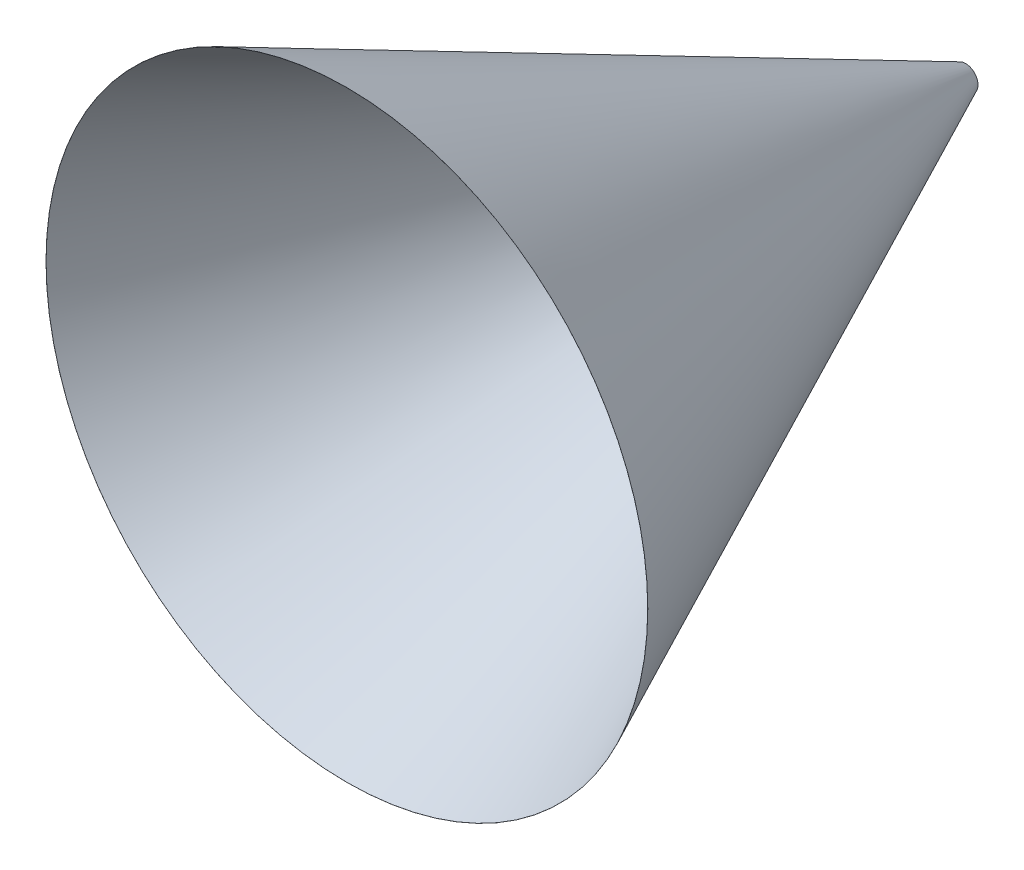
ISO-10303-21;
HEADER;
FILE_DESCRIPTION(('STEP AP214'),'2;1');
FILE_NAME('part.step','',(''),(''),'','','');
FILE_SCHEMA(('AUTOMOTIVE_DESIGN { 1 0 10303 214 1 1 1 1 }'));
ENDSEC;
DATA;
#1=APPLICATION_CONTEXT('core data for automotive mechanical design processes');
#2=APPLICATION_PROTOCOL_DEFINITION('international standard','automotive_design',2000,#1);
#3=PRODUCT_CONTEXT('',#1,'mechanical');
#4=PRODUCT('Part','Part','',(#3));
#5=PRODUCT_RELATED_PRODUCT_CATEGORY('part','',(#4));
#6=PRODUCT_DEFINITION_FORMATION('','',#4);
#7=PRODUCT_DEFINITION_CONTEXT('part definition',#1,'design');
#8=PRODUCT_DEFINITION('design','',#6,#7);
#9=PRODUCT_DEFINITION_SHAPE('','',#8);
#10=(LENGTH_UNIT() NAMED_UNIT(*) SI_UNIT(.MILLI.,.METRE.));
#11=(NAMED_UNIT(*) PLANE_ANGLE_UNIT() SI_UNIT($,.RADIAN.));
#12=(NAMED_UNIT(*) SI_UNIT($,.STERADIAN.) SOLID_ANGLE_UNIT());
#13=UNCERTAINTY_MEASURE_WITH_UNIT(LENGTH_MEASURE(1.E-05),#10,'distance_accuracy_value','');
#14=(GEOMETRIC_REPRESENTATION_CONTEXT(3) GLOBAL_UNCERTAINTY_ASSIGNED_CONTEXT((#13)) GLOBAL_UNIT_ASSIGNED_CONTEXT((#10,
#11,#12)) REPRESENTATION_CONTEXT('',''));
#15=CARTESIAN_POINT('',(0.,0.,0.));
#16=DIRECTION('',(0.,0.,1.));
#17=DIRECTION('',(1.,0.,0.));
#18=AXIS2_PLACEMENT_3D('',#15,#16,#17);
#19=CARTESIAN_POINT('',(0.,0.,0.));
#20=DIRECTION('',(0.,0.,1.));
#21=DIRECTION('',(1.,0.,0.));
#22=AXIS2_PLACEMENT_3D('',#19,#20,#21);
#23=CONICAL_SURFACE('',#22,3.,0.436332312998583);
#24=CARTESIAN_POINT('',(0.,0.,150.));
#25=DIRECTION('',(0.,0.,1.));
#26=DIRECTION('',(1.,0.,0.));
#27=AXIS2_PLACEMENT_3D('',#24,#25,#26);
#28=CIRCLE('',#27,72.9461487232499);
#29=CARTESIAN_POINT('',(72.9461487232499,0.,150.));
#30=VERTEX_POINT('',#29);
#31=EDGE_CURVE('E10',#30,#30,#28,.T.);
#32=CARTESIAN_POINT('',(0.,0.,0.));
#33=DIRECTION('',(0.,0.,1.));
#34=DIRECTION('',(1.,0.,0.));
#35=AXIS2_PLACEMENT_3D('',#32,#33,#34);
#36=CIRCLE('',#35,3.);
#37=CARTESIAN_POINT('',(3.,0.,0.));
#38=VERTEX_POINT('',#37);
#39=EDGE_CURVE('E38',#38,#38,#36,.T.);
#40=CARTESIAN_POINT('',(72.9461487232499,0.,150.));
#41=CARTESIAN_POINT('',(72.2175430073827,0.,148.4375));
#42=CARTESIAN_POINT('',(71.4889372915156,0.,146.875));
#43=CARTESIAN_POINT('',(70.0317258597812,0.,143.75));
#44=CARTESIAN_POINT('',(69.303120143914,0.,142.1875));
#45=CARTESIAN_POINT('',(67.8459087121796,0.,139.0625));
#46=CARTESIAN_POINT('',(67.1173029963124,0.,137.5));
#47=CARTESIAN_POINT('',(65.6600915645781,0.,134.375));
#48=CARTESIAN_POINT('',(64.9314858487109,0.,132.8125));
#49=CARTESIAN_POINT('',(63.4742744169765,0.,129.6875));
#50=CARTESIAN_POINT('',(62.7456687011093,0.,128.125));
#51=CARTESIAN_POINT('',(61.288457269375,0.,125.));
#52=CARTESIAN_POINT('',(60.5598515535078,0.,123.4375));
#53=CARTESIAN_POINT('',(59.1026401217734,0.,120.3125));
#54=CARTESIAN_POINT('',(58.3740344059062,0.,118.75));
#55=CARTESIAN_POINT('',(56.9168229741718,0.,115.625));
#56=CARTESIAN_POINT('',(56.1882172583046,0.,114.0625));
#57=CARTESIAN_POINT('',(54.7310058265703,0.,110.9375));
#58=CARTESIAN_POINT('',(54.0024001107031,0.,109.375));
#59=CARTESIAN_POINT('',(52.5451886789687,0.,106.25));
#60=CARTESIAN_POINT('',(51.8165829631015,0.,104.6875));
#61=CARTESIAN_POINT('',(50.3593715313672,0.,101.5625));
#62=CARTESIAN_POINT('',(49.6307658155,0.,100.));
#63=CARTESIAN_POINT('',(48.1735543837656,0.,96.875));
#64=CARTESIAN_POINT('',(47.4449486678984,0.,95.3125));
#65=CARTESIAN_POINT('',(45.987737236164,0.,92.1875));
#66=CARTESIAN_POINT('',(45.2591315202968,0.,90.625));
#67=CARTESIAN_POINT('',(43.8019200885625,0.,87.5));
#68=CARTESIAN_POINT('',(43.0733143726953,0.,85.9375));
#69=CARTESIAN_POINT('',(41.6161029409609,0.,82.8125));
#70=CARTESIAN_POINT('',(40.8874972250937,0.,81.25));
#71=CARTESIAN_POINT('',(39.4302857933593,0.,78.125));
#72=CARTESIAN_POINT('',(38.7016800774922,0.,76.5625));
#73=CARTESIAN_POINT('',(37.2444686457578,0.,73.4375));
#74=CARTESIAN_POINT('',(36.5158629298906,0.,71.875));
#75=CARTESIAN_POINT('',(35.0586514981562,0.,68.75));
#76=CARTESIAN_POINT('',(34.330045782289,0.,67.1875));
#77=CARTESIAN_POINT('',(32.8728343505547,0.,64.0625));
#78=CARTESIAN_POINT('',(32.1442286346875,0.,62.5));
#79=CARTESIAN_POINT('',(30.6870172029531,0.,59.375));
#80=CARTESIAN_POINT('',(29.9584114870859,0.,57.8125));
#81=CARTESIAN_POINT('',(28.5012000553515,0.,54.6875));
#82=CARTESIAN_POINT('',(27.7725943394843,0.,53.125));
#83=CARTESIAN_POINT('',(26.31538290775,0.,50.));
#84=CARTESIAN_POINT('',(25.5867771918828,0.,48.4375));
#85=CARTESIAN_POINT('',(24.1295657601484,0.,45.3125));
#86=CARTESIAN_POINT('',(23.4009600442812,0.,43.75));
#87=CARTESIAN_POINT('',(21.9437486125469,0.,40.625));
#88=CARTESIAN_POINT('',(21.2151428966797,0.,39.0625));
#89=CARTESIAN_POINT('',(19.7579314649453,0.,35.9375));
#90=CARTESIAN_POINT('',(19.0293257490781,0.,34.375));
#91=CARTESIAN_POINT('',(17.5721143173437,0.,31.25));
#92=CARTESIAN_POINT('',(16.8435086014766,0.,29.6875));
#93=CARTESIAN_POINT('',(15.3862971697422,0.,26.5625));
#94=CARTESIAN_POINT('',(14.657691453875,0.,25.));
#95=CARTESIAN_POINT('',(13.2004800221406,0.,21.875));
#96=CARTESIAN_POINT('',(12.4718743062734,0.,20.3125));
#97=CARTESIAN_POINT('',(11.0146628745391,0.,17.1875));
#98=CARTESIAN_POINT('',(10.2860571586719,0.,15.625));
#99=CARTESIAN_POINT('',(8.8288457269375,0.,12.5));
#100=CARTESIAN_POINT('',(8.10024001107031,0.,10.9375));
#101=CARTESIAN_POINT('',(6.64302857933594,0.,7.8125));
#102=CARTESIAN_POINT('',(5.91442286346875,0.,6.25000000000001));
#103=CARTESIAN_POINT('',(4.45721143173438,0.,3.12500000000001));
#104=CARTESIAN_POINT('',(3.72860571586719,0.,1.5625));
#105=CARTESIAN_POINT('',(3.,0.,0.));
#106=B_SPLINE_CURVE_WITH_KNOTS('',3,(#40,#41,#42,#43,#44,#45,#46,#47,#48,#49,#50,#51,#52,#53,
#54,#55,#56,#57,#58,#59,#60,#61,#62,#63,#64,#65,#66,#67,#68,#69,#70,#71,#72,#73,#74,#75,#76,#77,
#78,#79,#80,#81,#82,#83,#84,#85,#86,#87,#88,#89,#90,#91,#92,#93,#94,#95,#96,#97,#98,#99,#100,
#101,#102,#103,#104,#105),.UNSPECIFIED.,.F.,.F.,(4,2,2,2,2,2,2,2,2,2,2,2,2,2,2,2,2,2,2,2,2,2,2,
2,2,2,2,2,2,2,2,2,4),(0.,5.17208399513669,10.3441679902734,15.51625198541,20.6883359805467,
25.8604199756834,31.0325039708201,36.2045879659568,41.3766719610934,46.5487559562301,
51.7208399513668,56.8929239465035,62.0650079416402,67.2370919367768,72.4091759319135,
77.5812599270502,82.7533439221869,87.9254279173235,93.0975119124602,98.2695959075969,
103.441679902734,108.61376389787,113.785847893007,118.957931888144,124.13001588328,
129.302099878417,134.474183873554,139.64626786869,144.818351863827,149.990435858964,
155.1625198541,160.334603849237,165.506687844374),.UNSPECIFIED.);
#107=EDGE_CURVE('BSEAM32',#30,#38,#106,.T.);
#108=ORIENTED_EDGE('',*,*,#31,.F.);
#109=ORIENTED_EDGE('',*,*,#39,.T.);
#110=ORIENTED_EDGE('',*,*,#107,.T.);
#111=ORIENTED_EDGE('',*,*,#107,.F.);
#112=EDGE_LOOP('',(#108,#110,#109,#111));
#113=FACE_BOUND('',#112,.T.);
#114=ADVANCED_FACE('F32',(#113),#23,.T.);
#115=CARTESIAN_POINT('',(0.,0.,150.));
#116=DIRECTION('',(0.,0.,1.));
#117=DIRECTION('',(1.,0.,0.));
#118=AXIS2_PLACEMENT_3D('',#115,#116,#117);
#119=PLANE('',#118);
#120=CARTESIAN_POINT('',(0.,0.,150.));
#121=DIRECTION('',(0.,0.,1.));
#122=DIRECTION('',(1.,0.,0.));
#123=AXIS2_PLACEMENT_3D('',#120,#121,#122);
#124=CIRCLE('',#123,72.9351149440603);
#125=CARTESIAN_POINT('',(72.9351149440603,0.,150.));
#126=VERTEX_POINT('',#125);
#127=EDGE_CURVE('E42',#126,#126,#124,.T.);
#128=ORIENTED_EDGE('',*,*,#127,.F.);
#129=EDGE_LOOP('',(#128));
#130=FACE_BOUND('',#129,.T.);
#131=ORIENTED_EDGE('',*,*,#31,.T.);
#132=EDGE_LOOP('',(#131));
#133=FACE_BOUND('',#132,.T.);
#134=ADVANCED_FACE('F64',(#130,#133),#119,.T.);
#135=CARTESIAN_POINT('',(0.,0.,0.));
#136=DIRECTION('',(0.,0.,1.));
#137=DIRECTION('',(1.,0.,0.));
#138=AXIS2_PLACEMENT_3D('',#135,#136,#137);
#139=PLANE('',#138);
#140=ORIENTED_EDGE('',*,*,#39,.F.);
#141=EDGE_LOOP('',(#140));
#142=FACE_BOUND('',#141,.T.);
#143=ADVANCED_FACE('F56',(#142),#139,.F.);
#144=CARTESIAN_POINT('',(0.,0.,0.004226182617407));
#145=DIRECTION('',(0.,0.,1.));
#146=DIRECTION('',(1.,0.,0.));
#147=AXIS2_PLACEMENT_3D('',#144,#145,#146);
#148=CONICAL_SURFACE('',#147,2.99093692212963,0.436332312998583);
#149=CARTESIAN_POINT('',(0.,0.,0.01));
#150=DIRECTION('',(0.,0.,1.));
#151=DIRECTION('',(1.,0.,0.));
#152=AXIS2_PLACEMENT_3D('',#149,#150,#151);
#153=CIRCLE('',#152,2.99362929739193);
#154=CARTESIAN_POINT('',(2.99362929739193,0.,0.01));
#155=VERTEX_POINT('',#154);
#156=EDGE_CURVE('E46',#155,#155,#153,.T.);
#157=CARTESIAN_POINT('',(72.9351149440603,0.,150.));
#158=CARTESIAN_POINT('',(72.2065578019075,0.,148.437604166667));
#159=CARTESIAN_POINT('',(71.4780006597547,0.,146.875208333333));
#160=CARTESIAN_POINT('',(70.0208863754491,0.,143.750416666667));
#161=CARTESIAN_POINT('',(69.2923292332963,0.,142.188020833333));
#162=CARTESIAN_POINT('',(67.8352149489908,0.,139.063229166667));
#163=CARTESIAN_POINT('',(67.1066578068379,0.,137.500833333333));
#164=CARTESIAN_POINT('',(65.6495435225324,0.,134.376041666667));
#165=CARTESIAN_POINT('',(64.9209863803796,0.,132.813645833333));
#166=CARTESIAN_POINT('',(63.463872096074,0.,129.688854166667));
#167=CARTESIAN_POINT('',(62.7353149539212,0.,128.126458333333));
#168=CARTESIAN_POINT('',(61.2782006696156,0.,125.001666666667));
#169=CARTESIAN_POINT('',(60.5496435274628,0.,123.439270833333));
#170=CARTESIAN_POINT('',(59.0925292431572,0.,120.314479166667));
#171=CARTESIAN_POINT('',(58.3639721010044,0.,118.752083333333));
#172=CARTESIAN_POINT('',(56.9068578166988,0.,115.627291666667));
#173=CARTESIAN_POINT('',(56.178300674546,0.,114.064895833333));
#174=CARTESIAN_POINT('',(54.7211863902404,0.,110.940104166667));
#175=CARTESIAN_POINT('',(53.9926292480876,0.,109.377708333333));
#176=CARTESIAN_POINT('',(52.535514963782,0.,106.252916666667));
#177=CARTESIAN_POINT('',(51.8069578216292,0.,104.690520833333));
#178=CARTESIAN_POINT('',(50.3498435373237,0.,101.565729166667));
#179=CARTESIAN_POINT('',(49.6212863951708,0.,100.003333333333));
#180=CARTESIAN_POINT('',(48.1641721108653,0.,96.8785416666666));
#181=CARTESIAN_POINT('',(47.4356149687125,0.,95.3161458333333));
#182=CARTESIAN_POINT('',(45.9785006844069,0.,92.1913541666666));
#183=CARTESIAN_POINT('',(45.2499435422541,0.,90.6289583333333));
#184=CARTESIAN_POINT('',(43.7928292579485,0.,87.5041666666666));
#185=CARTESIAN_POINT('',(43.0642721157957,0.,85.9417708333333));
#186=CARTESIAN_POINT('',(41.6071578314901,0.,82.8169791666666));
#187=CARTESIAN_POINT('',(40.8786006893373,0.,81.2545833333333));
#188=CARTESIAN_POINT('',(39.4214864050317,0.,78.1297916666666));
#189=CARTESIAN_POINT('',(38.6929292628789,0.,76.5673958333333));
#190=CARTESIAN_POINT('',(37.2358149785733,0.,73.4426041666666));
#191=CARTESIAN_POINT('',(36.5072578364205,0.,71.8802083333333));
#192=CARTESIAN_POINT('',(35.0501435521149,0.,68.7554166666666));
#193=CARTESIAN_POINT('',(34.3215864099621,0.,67.1930208333333));
#194=CARTESIAN_POINT('',(32.8644721256566,0.,64.0682291666666));
#195=CARTESIAN_POINT('',(32.1359149835038,0.,62.5058333333333));
#196=CARTESIAN_POINT('',(30.6788006991982,0.,59.3810416666666));
#197=CARTESIAN_POINT('',(29.9502435570454,0.,57.8186458333333));
#198=CARTESIAN_POINT('',(28.4931292727398,0.,54.6938541666667));
#199=CARTESIAN_POINT('',(27.764572130587,0.,53.1314583333333));
#200=CARTESIAN_POINT('',(26.3074578462814,0.,50.0066666666667));
#201=CARTESIAN_POINT('',(25.5789007041286,0.,48.4442708333333));
#202=CARTESIAN_POINT('',(24.121786419823,0.,45.3194791666666));
#203=CARTESIAN_POINT('',(23.3932292776702,0.,43.7570833333333));
#204=CARTESIAN_POINT('',(21.9361149933646,0.,40.6322916666667));
#205=CARTESIAN_POINT('',(21.2075578512118,0.,39.0698958333333));
#206=CARTESIAN_POINT('',(19.7504435669062,0.,35.9451041666667));
#207=CARTESIAN_POINT('',(19.0218864247534,0.,34.3827083333333));
#208=CARTESIAN_POINT('',(17.5647721404478,0.,31.2579166666667));
#209=CARTESIAN_POINT('',(16.836214998295,0.,29.6955208333333));
#210=CARTESIAN_POINT('',(15.3791007139895,0.,26.5707291666667));
#211=CARTESIAN_POINT('',(14.6505435718367,0.,25.0083333333333));
#212=CARTESIAN_POINT('',(13.1934292875311,0.,21.8835416666667));
#213=CARTESIAN_POINT('',(12.4648721453783,0.,20.3211458333333));
#214=CARTESIAN_POINT('',(11.0077578610727,0.,17.1963541666667));
#215=CARTESIAN_POINT('',(10.2792007189199,0.,15.6339583333333));
#216=CARTESIAN_POINT('',(8.82208643461429,0.,12.5091666666667));
#217=CARTESIAN_POINT('',(8.09352929246149,0.,10.9467708333333));
#218=CARTESIAN_POINT('',(6.6364150081559,0.,7.82197916666666));
#219=CARTESIAN_POINT('',(5.90785786600311,0.,6.25958333333333));
#220=CARTESIAN_POINT('',(4.45074358169752,0.,3.13479166666666));
#221=CARTESIAN_POINT('',(3.72218643954472,0.,1.57239583333333));
#222=CARTESIAN_POINT('',(2.99362929739193,0.,0.00999999999999975));
#223=B_SPLINE_CURVE_WITH_KNOTS('',3,(#157,#158,#159,#160,#161,#162,#163,#164,#165,#166,#167,
#168,#169,#170,#171,#172,#173,#174,#175,#176,#177,#178,#179,#180,#181,#182,#183,#184,#185,#186,
#187,#188,#189,#190,#191,#192,#193,#194,#195,#196,#197,#198,#199,#200,#201,#202,#203,#204,#205,
#206,#207,#208,#209,#210,#211,#212,#213,#214,#215,#216,#217,#218,#219,#220,#221,#222),
.UNSPECIFIED.,.F.,.F.,(4,2,2,2,2,2,2,2,2,2,2,2,2,2,2,2,2,2,2,2,2,2,2,2,2,2,2,2,2,2,2,2,4),(0.,
5.171739189537,10.343478379074,15.515217568611,20.686956758148,25.858695947685,31.0304351372221,
36.2021743267591,41.373913516296,46.545652705833,51.7173918953701,56.8891310849071,
62.0608702744441,67.2326094639811,72.4043486535181,77.5760878430551,82.7478270325921,
87.9195662221291,93.0913054116661,98.2630446012031,103.43478379074,108.606522980277,
113.778262169814,118.950001359351,124.121740548888,129.293479738425,134.465218927962,
139.636958117499,144.808697307036,149.980436496573,155.15217568611,160.323914875647,
165.495654065184),.UNSPECIFIED.);
#224=EDGE_CURVE('BSEAM54',#126,#155,#223,.T.);
#225=ORIENTED_EDGE('',*,*,#127,.T.);
#226=ORIENTED_EDGE('',*,*,#156,.F.);
#227=ORIENTED_EDGE('',*,*,#224,.T.);
#228=ORIENTED_EDGE('',*,*,#224,.F.);
#229=EDGE_LOOP('',(#225,#227,#226,#228));
#230=FACE_BOUND('',#229,.T.);
#231=ADVANCED_FACE('F54',(#230),#148,.F.);
#232=CARTESIAN_POINT('',(0.,0.,0.01));
#233=DIRECTION('',(0.,0.,1.));
#234=DIRECTION('',(1.,0.,0.));
#235=AXIS2_PLACEMENT_3D('',#232,#233,#234);
#236=PLANE('',#235);
#237=ORIENTED_EDGE('',*,*,#156,.T.);
#238=EDGE_LOOP('',(#237));
#239=FACE_BOUND('',#238,.T.);
#240=ADVANCED_FACE('F52',(#239),#236,.T.);
#241=CLOSED_SHELL('',(#114,#134,#143,#231,#240));
#242=MANIFOLD_SOLID_BREP('B2',#241);
#243=ADVANCED_BREP_SHAPE_REPRESENTATION('',(#18,#242),#14);
#244=SHAPE_DEFINITION_REPRESENTATION(#9,#243);
ENDSEC;
END-ISO-10303-21;
